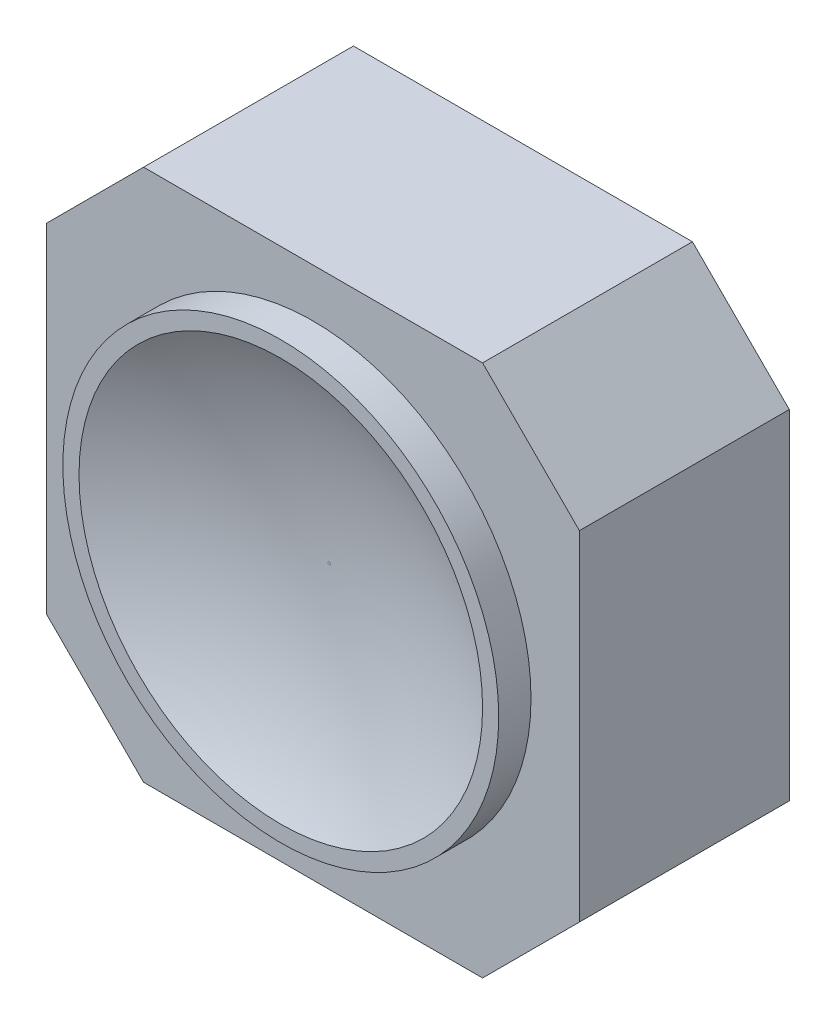
ISO-10303-21;
HEADER;
FILE_DESCRIPTION(('STEP AP214'),'2;1');
FILE_NAME('part.step','',(''),(''),'','','');
FILE_SCHEMA(('AUTOMOTIVE_DESIGN { 1 0 10303 214 1 1 1 1 }'));
ENDSEC;
DATA;
#1=APPLICATION_CONTEXT('core data for automotive mechanical design processes');
#2=APPLICATION_PROTOCOL_DEFINITION('international standard','automotive_design',2000,#1);
#3=PRODUCT_CONTEXT('',#1,'mechanical');
#4=PRODUCT('Part','Part','',(#3));
#5=PRODUCT_RELATED_PRODUCT_CATEGORY('part','',(#4));
#6=PRODUCT_DEFINITION_FORMATION('','',#4);
#7=PRODUCT_DEFINITION_CONTEXT('part definition',#1,'design');
#8=PRODUCT_DEFINITION('design','',#6,#7);
#9=PRODUCT_DEFINITION_SHAPE('','',#8);
#10=(LENGTH_UNIT() NAMED_UNIT(*) SI_UNIT(.MILLI.,.METRE.));
#11=(NAMED_UNIT(*) PLANE_ANGLE_UNIT() SI_UNIT($,.RADIAN.));
#12=(NAMED_UNIT(*) SI_UNIT($,.STERADIAN.) SOLID_ANGLE_UNIT());
#13=UNCERTAINTY_MEASURE_WITH_UNIT(LENGTH_MEASURE(1.E-05),#10,'distance_accuracy_value','');
#14=(GEOMETRIC_REPRESENTATION_CONTEXT(3) GLOBAL_UNCERTAINTY_ASSIGNED_CONTEXT((#13)) GLOBAL_UNIT_ASSIGNED_CONTEXT((#10,
#11,#12)) REPRESENTATION_CONTEXT('',''));
#15=CARTESIAN_POINT('',(0.,0.,0.));
#16=DIRECTION('',(0.,0.,1.));
#17=DIRECTION('',(1.,0.,0.));
#18=AXIS2_PLACEMENT_3D('',#15,#16,#17);
#19=CARTESIAN_POINT('',(0.,0.,3.));
#20=DIRECTION('',(0.,0.,-1.));
#21=DIRECTION('',(-1.,0.,0.));
#22=AXIS2_PLACEMENT_3D('',#19,#20,#21);
#23=CYLINDRICAL_SURFACE('',#22,6.5);
#24=DIRECTION('',(0.,0.,-1.));
#25=VECTOR('',#24,1.);
#26=CARTESIAN_POINT('',(-6.35290287978653,1.375,3.));
#27=LINE('',#26,#25);
#28=CARTESIAN_POINT('',(-6.35290287978653,1.375,0.));
#29=VERTEX_POINT('',#28);
#30=CARTESIAN_POINT('',(-6.35290287978653,1.375,3.));
#31=VERTEX_POINT('',#30);
#32=EDGE_CURVE('E187',#29,#31,#27,.F.);
#33=ORIENTED_EDGE('',*,*,#32,.F.);
#34=CARTESIAN_POINT('',(0.,0.,0.));
#35=DIRECTION('',(0.,0.,-1.));
#36=DIRECTION('',(-1.,0.,0.));
#37=AXIS2_PLACEMENT_3D('',#34,#35,#36);
#38=CIRCLE('',#37,6.5);
#39=CARTESIAN_POINT('',(6.35290287978653,1.375,0.));
#40=VERTEX_POINT('',#39);
#41=EDGE_CURVE('E164',#29,#40,#38,.T.);
#42=ORIENTED_EDGE('',*,*,#41,.T.);
#43=DIRECTION('',(0.,0.,-1.));
#44=VECTOR('',#43,1.);
#45=CARTESIAN_POINT('',(6.35290287978653,1.375,3.));
#46=LINE('',#45,#44);
#47=CARTESIAN_POINT('',(6.35290287978653,1.375,3.));
#48=VERTEX_POINT('',#47);
#49=EDGE_CURVE('E215',#48,#40,#46,.T.);
#50=ORIENTED_EDGE('',*,*,#49,.F.);
#51=CARTESIAN_POINT('',(0.,0.,3.));
#52=DIRECTION('',(0.,0.,-1.));
#53=DIRECTION('',(-1.,0.,0.));
#54=AXIS2_PLACEMENT_3D('',#51,#52,#53);
#55=CIRCLE('',#54,6.5);
#56=EDGE_CURVE('E227',#31,#48,#55,.T.);
#57=ORIENTED_EDGE('',*,*,#56,.F.);
#58=EDGE_LOOP('',(#33,#42,#50,#57));
#59=FACE_BOUND('',#58,.T.);
#60=ADVANCED_FACE('F41',(#59),#23,.F.);
#61=DIRECTION('',(0.,0.,-1.));
#62=VECTOR('',#61,1.);
#63=CARTESIAN_POINT('',(-6.35290287978653,-1.375,3.));
#64=LINE('',#63,#62);
#65=CARTESIAN_POINT('',(-6.35290287978653,-1.375,3.));
#66=VERTEX_POINT('',#65);
#67=CARTESIAN_POINT('',(-6.35290287978653,-1.375,0.));
#68=VERTEX_POINT('',#67);
#69=EDGE_CURVE('E183',#66,#68,#64,.T.);
#70=ORIENTED_EDGE('',*,*,#69,.F.);
#71=CARTESIAN_POINT('',(6.35290287978653,-1.375,3.));
#72=VERTEX_POINT('',#71);
#73=EDGE_CURVE('E222',#72,#66,#55,.T.);
#74=ORIENTED_EDGE('',*,*,#73,.F.);
#75=DIRECTION('',(0.,0.,-1.));
#76=VECTOR('',#75,1.);
#77=CARTESIAN_POINT('',(6.35290287978653,-1.375,3.));
#78=LINE('',#77,#76);
#79=CARTESIAN_POINT('',(6.35290287978653,-1.375,0.));
#80=VERTEX_POINT('',#79);
#81=EDGE_CURVE('E219',#80,#72,#78,.F.);
#82=ORIENTED_EDGE('',*,*,#81,.F.);
#83=EDGE_CURVE('E228',#80,#68,#38,.T.);
#84=ORIENTED_EDGE('',*,*,#83,.T.);
#85=EDGE_LOOP('',(#70,#74,#82,#84));
#86=FACE_BOUND('',#85,.T.);
#87=ADVANCED_FACE('F343',(#86),#23,.F.);
#88=CARTESIAN_POINT('',(0.,0.,3.));
#89=DIRECTION('',(0.,0.,-1.));
#90=DIRECTION('',(-1.,0.,0.));
#91=AXIS2_PLACEMENT_3D('',#88,#89,#90);
#92=PLANE('',#91);
#93=DIRECTION('',(0.,-1.,0.));
#94=VECTOR('',#93,1.);
#95=CARTESIAN_POINT('',(-3.25,1.375,3.));
#96=LINE('',#95,#94);
#97=CARTESIAN_POINT('',(-3.25,1.375,3.));
#98=VERTEX_POINT('',#97);
#99=CARTESIAN_POINT('',(-3.25,-1.375,3.));
#100=VERTEX_POINT('',#99);
#101=EDGE_CURVE('E500',#98,#100,#96,.T.);
#102=ORIENTED_EDGE('',*,*,#101,.F.);
#103=DIRECTION('',(1.,0.,0.));
#104=VECTOR('',#103,1.);
#105=CARTESIAN_POINT('',(-7.20750360727607,1.375,3.));
#106=LINE('',#105,#104);
#107=EDGE_CURVE('E181',#31,#98,#106,.T.);
#108=ORIENTED_EDGE('',*,*,#107,.F.);
#109=ORIENTED_EDGE('',*,*,#56,.T.);
#110=DIRECTION('',(1.,0.,0.));
#111=VECTOR('',#110,1.);
#112=CARTESIAN_POINT('',(7.20750360727607,1.375,3.));
#113=LINE('',#112,#111);
#114=CARTESIAN_POINT('',(3.25,1.375,3.));
#115=VERTEX_POINT('',#114);
#116=EDGE_CURVE('E199',#115,#48,#113,.T.);
#117=ORIENTED_EDGE('',*,*,#116,.F.);
#118=DIRECTION('',(0.,1.,0.));
#119=VECTOR('',#118,1.);
#120=CARTESIAN_POINT('',(3.25,1.375,3.));
#121=LINE('',#120,#119);
#122=CARTESIAN_POINT('',(3.25,-1.375,3.));
#123=VERTEX_POINT('',#122);
#124=EDGE_CURVE('E194',#123,#115,#121,.T.);
#125=ORIENTED_EDGE('',*,*,#124,.F.);
#126=DIRECTION('',(1.,0.,0.));
#127=VECTOR('',#126,1.);
#128=CARTESIAN_POINT('',(0.,-1.375,3.));
#129=LINE('',#128,#127);
#130=EDGE_CURVE('E11',#123,#72,#129,.T.);
#131=ORIENTED_EDGE('',*,*,#130,.T.);
#132=ORIENTED_EDGE('',*,*,#73,.T.);
#133=DIRECTION('',(-1.,0.,0.));
#134=VECTOR('',#133,1.);
#135=CARTESIAN_POINT('',(-7.20750360727607,-1.375,3.));
#136=LINE('',#135,#134);
#137=EDGE_CURVE('E169',#100,#66,#136,.T.);
#138=ORIENTED_EDGE('',*,*,#137,.F.);
#139=EDGE_LOOP('',(#102,#108,#109,#117,#125,#131,#132,#138));
#140=FACE_BOUND('',#139,.T.);
#141=ADVANCED_FACE('F349',(#140),#92,.T.);
#142=CARTESIAN_POINT('',(0.,0.,6.5));
#143=DIRECTION('',(0.,0.,1.));
#144=DIRECTION('',(1.,0.,0.));
#145=AXIS2_PLACEMENT_3D('',#142,#143,#144);
#146=PLANE('',#145);
#147=DIRECTION('',(0.,-1.,0.));
#148=VECTOR('',#147,1.);
#149=CARTESIAN_POINT('',(-8.25,5.25,6.5));
#150=LINE('',#149,#148);
#151=CARTESIAN_POINT('',(-8.25,5.25,6.5));
#152=VERTEX_POINT('',#151);
#153=CARTESIAN_POINT('',(-8.25,-5.25,6.5));
#154=VERTEX_POINT('',#153);
#155=EDGE_CURVE('E244',#152,#154,#150,.T.);
#156=ORIENTED_EDGE('',*,*,#155,.T.);
#157=DIRECTION('',(0.707106781186547,-0.707106781186548,0.));
#158=VECTOR('',#157,1.);
#159=CARTESIAN_POINT('',(-8.25,-5.25,6.5));
#160=LINE('',#159,#158);
#161=CARTESIAN_POINT('',(-5.25,-8.25,6.5));
#162=VERTEX_POINT('',#161);
#163=EDGE_CURVE('E248',#154,#162,#160,.T.);
#164=ORIENTED_EDGE('',*,*,#163,.T.);
#165=DIRECTION('',(1.,0.,0.));
#166=VECTOR('',#165,1.);
#167=CARTESIAN_POINT('',(-5.25,-8.25,6.5));
#168=LINE('',#167,#166);
#169=CARTESIAN_POINT('',(5.25,-8.25,6.5));
#170=VERTEX_POINT('',#169);
#171=EDGE_CURVE('E252',#162,#170,#168,.T.);
#172=ORIENTED_EDGE('',*,*,#171,.T.);
#173=DIRECTION('',(0.707106781186548,0.707106781186548,0.));
#174=VECTOR('',#173,1.);
#175=CARTESIAN_POINT('',(5.25,-8.25,6.5));
#176=LINE('',#175,#174);
#177=CARTESIAN_POINT('',(8.25,-5.25,6.5));
#178=VERTEX_POINT('',#177);
#179=EDGE_CURVE('E255',#170,#178,#176,.T.);
#180=ORIENTED_EDGE('',*,*,#179,.T.);
#181=DIRECTION('',(0.,1.,0.));
#182=VECTOR('',#181,1.);
#183=CARTESIAN_POINT('',(8.25,5.25,6.5));
#184=LINE('',#183,#182);
#185=CARTESIAN_POINT('',(8.25,5.25,6.5));
#186=VERTEX_POINT('',#185);
#187=EDGE_CURVE('E258',#178,#186,#184,.T.);
#188=ORIENTED_EDGE('',*,*,#187,.T.);
#189=DIRECTION('',(-0.707106781186548,0.707106781186547,0.));
#190=VECTOR('',#189,1.);
#191=CARTESIAN_POINT('',(5.25,8.25,6.5));
#192=LINE('',#191,#190);
#193=CARTESIAN_POINT('',(5.25,8.25,6.5));
#194=VERTEX_POINT('',#193);
#195=EDGE_CURVE('E261',#186,#194,#192,.T.);
#196=ORIENTED_EDGE('',*,*,#195,.T.);
#197=DIRECTION('',(-1.,0.,0.));
#198=VECTOR('',#197,1.);
#199=CARTESIAN_POINT('',(-5.25,8.25,6.5));
#200=LINE('',#199,#198);
#201=CARTESIAN_POINT('',(-5.25,8.25,6.5));
#202=VERTEX_POINT('',#201);
#203=EDGE_CURVE('E264',#194,#202,#200,.T.);
#204=ORIENTED_EDGE('',*,*,#203,.T.);
#205=DIRECTION('',(-0.707106781186547,-0.707106781186548,0.));
#206=VECTOR('',#205,1.);
#207=CARTESIAN_POINT('',(-8.25,5.25,6.5));
#208=LINE('',#207,#206);
#209=EDGE_CURVE('E267',#202,#152,#208,.T.);
#210=ORIENTED_EDGE('',*,*,#209,.T.);
#211=EDGE_LOOP('',(#156,#164,#172,#180,#188,#196,#204,#210));
#212=FACE_BOUND('',#211,.T.);
#213=CARTESIAN_POINT('',(0.,0.,6.5));
#214=DIRECTION('',(0.,0.,1.));
#215=DIRECTION('',(1.,0.,0.));
#216=AXIS2_PLACEMENT_3D('',#213,#214,#215);
#217=CIRCLE('',#216,6.75);
#218=CARTESIAN_POINT('',(6.75,0.,6.5));
#219=VERTEX_POINT('',#218);
#220=EDGE_CURVE('E235',#219,#219,#217,.T.);
#221=ORIENTED_EDGE('',*,*,#220,.F.);
#222=EDGE_LOOP('',(#221));
#223=FACE_BOUND('',#222,.T.);
#224=ADVANCED_FACE('F360',(#212,#223),#146,.T.);
#225=CARTESIAN_POINT('',(-8.25,5.25,6.5));
#226=DIRECTION('',(1.,0.,0.));
#227=DIRECTION('',(0.,1.,0.));
#228=AXIS2_PLACEMENT_3D('',#225,#226,#227);
#229=PLANE('',#228);
#230=DIRECTION('',(0.,-1.,0.));
#231=VECTOR('',#230,1.);
#232=CARTESIAN_POINT('',(-8.25,5.25,0.));
#233=LINE('',#232,#231);
#234=CARTESIAN_POINT('',(-8.25,5.25,0.));
#235=VERTEX_POINT('',#234);
#236=CARTESIAN_POINT('',(-8.25,-5.25,0.));
#237=VERTEX_POINT('',#236);
#238=EDGE_CURVE('E240',#235,#237,#233,.T.);
#239=ORIENTED_EDGE('',*,*,#238,.T.);
#240=DIRECTION('',(0.,0.,-1.));
#241=VECTOR('',#240,1.);
#242=CARTESIAN_POINT('',(-8.25,-5.25,6.5));
#243=LINE('',#242,#241);
#244=EDGE_CURVE('E321',#154,#237,#243,.T.);
#245=ORIENTED_EDGE('',*,*,#244,.F.);
#246=ORIENTED_EDGE('',*,*,#155,.F.);
#247=DIRECTION('',(0.,0.,-1.));
#248=VECTOR('',#247,1.);
#249=CARTESIAN_POINT('',(-8.25,5.25,6.5));
#250=LINE('',#249,#248);
#251=EDGE_CURVE('E270',#152,#235,#250,.T.);
#252=ORIENTED_EDGE('',*,*,#251,.T.);
#253=EDGE_LOOP('',(#239,#245,#246,#252));
#254=FACE_BOUND('',#253,.T.);
#255=ADVANCED_FACE('F363',(#254),#229,.F.);
#256=CARTESIAN_POINT('',(-8.25,-5.25,6.5));
#257=DIRECTION('',(0.707106781186548,0.707106781186547,0.));
#258=DIRECTION('',(-0.707106781186547,0.707106781186548,0.));
#259=AXIS2_PLACEMENT_3D('',#256,#257,#258);
#260=PLANE('',#259);
#261=DIRECTION('',(0.707106781186547,-0.707106781186548,0.));
#262=VECTOR('',#261,1.);
#263=CARTESIAN_POINT('',(-8.25,-5.25,0.));
#264=LINE('',#263,#262);
#265=CARTESIAN_POINT('',(-5.25,-8.25,0.));
#266=VERTEX_POINT('',#265);
#267=EDGE_CURVE('E274',#237,#266,#264,.T.);
#268=ORIENTED_EDGE('',*,*,#267,.T.);
#269=DIRECTION('',(0.,0.,-1.));
#270=VECTOR('',#269,1.);
#271=CARTESIAN_POINT('',(-5.25,-8.25,6.5));
#272=LINE('',#271,#270);
#273=EDGE_CURVE('E317',#162,#266,#272,.T.);
#274=ORIENTED_EDGE('',*,*,#273,.F.);
#275=ORIENTED_EDGE('',*,*,#163,.F.);
#276=ORIENTED_EDGE('',*,*,#244,.T.);
#277=EDGE_LOOP('',(#268,#274,#275,#276));
#278=FACE_BOUND('',#277,.T.);
#279=ADVANCED_FACE('F390',(#278),#260,.F.);
#280=CARTESIAN_POINT('',(-5.25,-8.25,6.5));
#281=DIRECTION('',(0.,1.,0.));
#282=DIRECTION('',(0.,0.,1.));
#283=AXIS2_PLACEMENT_3D('',#280,#281,#282);
#284=PLANE('',#283);
#285=DIRECTION('',(1.,0.,0.));
#286=VECTOR('',#285,1.);
#287=CARTESIAN_POINT('',(-5.25,-8.25,0.));
#288=LINE('',#287,#286);
#289=CARTESIAN_POINT('',(5.25,-8.25,0.));
#290=VERTEX_POINT('',#289);
#291=EDGE_CURVE('E277',#266,#290,#288,.T.);
#292=ORIENTED_EDGE('',*,*,#291,.T.);
#293=DIRECTION('',(0.,0.,-1.));
#294=VECTOR('',#293,1.);
#295=CARTESIAN_POINT('',(5.25,-8.25,6.5));
#296=LINE('',#295,#294);
#297=EDGE_CURVE('E313',#170,#290,#296,.T.);
#298=ORIENTED_EDGE('',*,*,#297,.F.);
#299=ORIENTED_EDGE('',*,*,#171,.F.);
#300=ORIENTED_EDGE('',*,*,#273,.T.);
#301=EDGE_LOOP('',(#292,#298,#299,#300));
#302=FACE_BOUND('',#301,.T.);
#303=ADVANCED_FACE('F386',(#302),#284,.F.);
#304=CARTESIAN_POINT('',(5.25,-8.25,6.5));
#305=DIRECTION('',(-0.707106781186548,0.707106781186548,0.));
#306=DIRECTION('',(-0.707106781186548,-0.707106781186548,0.));
#307=AXIS2_PLACEMENT_3D('',#304,#305,#306);
#308=PLANE('',#307);
#309=DIRECTION('',(0.707106781186548,0.707106781186548,0.));
#310=VECTOR('',#309,1.);
#311=CARTESIAN_POINT('',(5.25,-8.25,0.));
#312=LINE('',#311,#310);
#313=CARTESIAN_POINT('',(8.25,-5.25,0.));
#314=VERTEX_POINT('',#313);
#315=EDGE_CURVE('E280',#290,#314,#312,.T.);
#316=ORIENTED_EDGE('',*,*,#315,.T.);
#317=DIRECTION('',(0.,0.,-1.));
#318=VECTOR('',#317,1.);
#319=CARTESIAN_POINT('',(8.25,-5.25,6.5));
#320=LINE('',#319,#318);
#321=EDGE_CURVE('E309',#178,#314,#320,.T.);
#322=ORIENTED_EDGE('',*,*,#321,.F.);
#323=ORIENTED_EDGE('',*,*,#179,.F.);
#324=ORIENTED_EDGE('',*,*,#297,.T.);
#325=EDGE_LOOP('',(#316,#322,#323,#324));
#326=FACE_BOUND('',#325,.T.);
#327=ADVANCED_FACE('F382',(#326),#308,.F.);
#328=CARTESIAN_POINT('',(8.25,5.25,6.5));
#329=DIRECTION('',(-1.,0.,0.));
#330=DIRECTION('',(0.,-1.,0.));
#331=AXIS2_PLACEMENT_3D('',#328,#329,#330);
#332=PLANE('',#331);
#333=DIRECTION('',(0.,1.,0.));
#334=VECTOR('',#333,1.);
#335=CARTESIAN_POINT('',(8.25,5.25,0.));
#336=LINE('',#335,#334);
#337=CARTESIAN_POINT('',(8.25,5.25,0.));
#338=VERTEX_POINT('',#337);
#339=EDGE_CURVE('E283',#314,#338,#336,.T.);
#340=ORIENTED_EDGE('',*,*,#339,.T.);
#341=DIRECTION('',(0.,0.,-1.));
#342=VECTOR('',#341,1.);
#343=CARTESIAN_POINT('',(8.25,5.25,6.5));
#344=LINE('',#343,#342);
#345=EDGE_CURVE('E305',#186,#338,#344,.T.);
#346=ORIENTED_EDGE('',*,*,#345,.F.);
#347=ORIENTED_EDGE('',*,*,#187,.F.);
#348=ORIENTED_EDGE('',*,*,#321,.T.);
#349=EDGE_LOOP('',(#340,#346,#347,#348));
#350=FACE_BOUND('',#349,.T.);
#351=ADVANCED_FACE('F378',(#350),#332,.F.);
#352=CARTESIAN_POINT('',(5.25,8.25,6.5));
#353=DIRECTION('',(-0.707106781186547,-0.707106781186548,0.));
#354=DIRECTION('',(0.707106781186548,-0.707106781186547,0.));
#355=AXIS2_PLACEMENT_3D('',#352,#353,#354);
#356=PLANE('',#355);
#357=DIRECTION('',(-0.707106781186548,0.707106781186547,0.));
#358=VECTOR('',#357,1.);
#359=CARTESIAN_POINT('',(5.25,8.25,0.));
#360=LINE('',#359,#358);
#361=CARTESIAN_POINT('',(5.25,8.25,0.));
#362=VERTEX_POINT('',#361);
#363=EDGE_CURVE('E286',#338,#362,#360,.T.);
#364=ORIENTED_EDGE('',*,*,#363,.T.);
#365=DIRECTION('',(0.,0.,-1.));
#366=VECTOR('',#365,1.);
#367=CARTESIAN_POINT('',(5.25,8.25,6.5));
#368=LINE('',#367,#366);
#369=EDGE_CURVE('E301',#194,#362,#368,.T.);
#370=ORIENTED_EDGE('',*,*,#369,.F.);
#371=ORIENTED_EDGE('',*,*,#195,.F.);
#372=ORIENTED_EDGE('',*,*,#345,.T.);
#373=EDGE_LOOP('',(#364,#370,#371,#372));
#374=FACE_BOUND('',#373,.T.);
#375=ADVANCED_FACE('F374',(#374),#356,.F.);
#376=CARTESIAN_POINT('',(-5.25,8.25,6.5));
#377=DIRECTION('',(0.,-1.,0.));
#378=DIRECTION('',(0.,0.,-1.));
#379=AXIS2_PLACEMENT_3D('',#376,#377,#378);
#380=PLANE('',#379);
#381=DIRECTION('',(-1.,0.,0.));
#382=VECTOR('',#381,1.);
#383=CARTESIAN_POINT('',(-5.25,8.25,0.));
#384=LINE('',#383,#382);
#385=CARTESIAN_POINT('',(-5.25,8.25,0.));
#386=VERTEX_POINT('',#385);
#387=EDGE_CURVE('E289',#362,#386,#384,.T.);
#388=ORIENTED_EDGE('',*,*,#387,.T.);
#389=DIRECTION('',(0.,0.,-1.));
#390=VECTOR('',#389,1.);
#391=CARTESIAN_POINT('',(-5.25,8.25,6.5));
#392=LINE('',#391,#390);
#393=EDGE_CURVE('E297',#202,#386,#392,.T.);
#394=ORIENTED_EDGE('',*,*,#393,.F.);
#395=ORIENTED_EDGE('',*,*,#203,.F.);
#396=ORIENTED_EDGE('',*,*,#369,.T.);
#397=EDGE_LOOP('',(#388,#394,#395,#396));
#398=FACE_BOUND('',#397,.T.);
#399=ADVANCED_FACE('F370',(#398),#380,.F.);
#400=CARTESIAN_POINT('',(-8.25,5.25,6.5));
#401=DIRECTION('',(0.707106781186548,-0.707106781186547,0.));
#402=DIRECTION('',(0.707106781186547,0.707106781186548,0.));
#403=AXIS2_PLACEMENT_3D('',#400,#401,#402);
#404=PLANE('',#403);
#405=DIRECTION('',(-0.707106781186547,-0.707106781186548,0.));
#406=VECTOR('',#405,1.);
#407=CARTESIAN_POINT('',(-8.25,5.25,0.));
#408=LINE('',#407,#406);
#409=EDGE_CURVE('E249',#386,#235,#408,.T.);
#410=ORIENTED_EDGE('',*,*,#409,.T.);
#411=ORIENTED_EDGE('',*,*,#251,.F.);
#412=ORIENTED_EDGE('',*,*,#209,.F.);
#413=ORIENTED_EDGE('',*,*,#393,.T.);
#414=EDGE_LOOP('',(#410,#411,#412,#413));
#415=FACE_BOUND('',#414,.T.);
#416=ADVANCED_FACE('F367',(#415),#404,.F.);
#417=CARTESIAN_POINT('',(0.,0.,0.));
#418=DIRECTION('',(0.,0.,1.));
#419=DIRECTION('',(1.,0.,0.));
#420=AXIS2_PLACEMENT_3D('',#417,#418,#419);
#421=PLANE('',#420);
#422=ORIENTED_EDGE('',*,*,#41,.F.);
#423=DIRECTION('',(1.,0.,0.));
#424=VECTOR('',#423,1.);
#425=CARTESIAN_POINT('',(-7.20750360727607,1.375,0.));
#426=LINE('',#425,#424);
#427=CARTESIAN_POINT('',(-3.25,1.375,0.));
#428=VERTEX_POINT('',#427);
#429=EDGE_CURVE('E157',#29,#428,#426,.T.);
#430=ORIENTED_EDGE('',*,*,#429,.T.);
#431=DIRECTION('',(0.,-1.,0.));
#432=VECTOR('',#431,1.);
#433=CARTESIAN_POINT('',(-3.25,1.375,0.));
#434=LINE('',#433,#432);
#435=CARTESIAN_POINT('',(-3.25,-1.375,0.));
#436=VERTEX_POINT('',#435);
#437=EDGE_CURVE('E162',#428,#436,#434,.T.);
#438=ORIENTED_EDGE('',*,*,#437,.T.);
#439=DIRECTION('',(-1.,0.,0.));
#440=VECTOR('',#439,1.);
#441=CARTESIAN_POINT('',(-7.20750360727607,-1.375,0.));
#442=LINE('',#441,#440);
#443=EDGE_CURVE('E177',#436,#68,#442,.T.);
#444=ORIENTED_EDGE('',*,*,#443,.T.);
#445=ORIENTED_EDGE('',*,*,#83,.F.);
#446=DIRECTION('',(-1.,0.,0.));
#447=VECTOR('',#446,1.);
#448=CARTESIAN_POINT('',(7.20750360727607,-1.375,0.));
#449=LINE('',#448,#447);
#450=CARTESIAN_POINT('',(3.25,-1.375,0.));
#451=VERTEX_POINT('',#450);
#452=EDGE_CURVE('E195',#80,#451,#449,.T.);
#453=ORIENTED_EDGE('',*,*,#452,.T.);
#454=DIRECTION('',(0.,1.,0.));
#455=VECTOR('',#454,1.);
#456=CARTESIAN_POINT('',(3.25,1.375,0.));
#457=LINE('',#456,#455);
#458=CARTESIAN_POINT('',(3.25,1.375,0.));
#459=VERTEX_POINT('',#458);
#460=EDGE_CURVE('E198',#451,#459,#457,.T.);
#461=ORIENTED_EDGE('',*,*,#460,.T.);
#462=DIRECTION('',(1.,0.,0.));
#463=VECTOR('',#462,1.);
#464=CARTESIAN_POINT('',(7.20750360727607,1.375,0.));
#465=LINE('',#464,#463);
#466=EDGE_CURVE('E202',#459,#40,#465,.T.);
#467=ORIENTED_EDGE('',*,*,#466,.T.);
#468=EDGE_LOOP('',(#422,#430,#438,#444,#445,#453,#461,#467));
#469=FACE_BOUND('',#468,.T.);
#470=ORIENTED_EDGE('',*,*,#238,.F.);
#471=ORIENTED_EDGE('',*,*,#409,.F.);
#472=ORIENTED_EDGE('',*,*,#387,.F.);
#473=ORIENTED_EDGE('',*,*,#363,.F.);
#474=ORIENTED_EDGE('',*,*,#339,.F.);
#475=ORIENTED_EDGE('',*,*,#315,.F.);
#476=ORIENTED_EDGE('',*,*,#291,.F.);
#477=ORIENTED_EDGE('',*,*,#267,.F.);
#478=EDGE_LOOP('',(#470,#471,#472,#473,#474,#475,#476,#477));
#479=FACE_BOUND('',#478,.T.);
#480=ADVANCED_FACE('F159',(#469,#479),#421,.F.);
#481=CARTESIAN_POINT('',(0.,0.,7.5));
#482=DIRECTION('',(0.,0.,1.));
#483=DIRECTION('',(1.,0.,0.));
#484=AXIS2_PLACEMENT_3D('',#481,#482,#483);
#485=PLANE('',#484);
#486=CARTESIAN_POINT('',(0.,0.,7.5));
#487=DIRECTION('',(0.,0.,1.));
#488=DIRECTION('',(1.,0.,0.));
#489=AXIS2_PLACEMENT_3D('',#486,#487,#488);
#490=CIRCLE('',#489,6.75);
#491=CARTESIAN_POINT('',(6.75,0.,7.5));
#492=VERTEX_POINT('',#491);
#493=EDGE_CURVE('E236',#492,#492,#490,.T.);
#494=ORIENTED_EDGE('',*,*,#493,.T.);
#495=EDGE_LOOP('',(#494));
#496=FACE_BOUND('',#495,.T.);
#497=CARTESIAN_POINT('',(0.,0.,7.5));
#498=DIRECTION('',(0.,0.,1.));
#499=DIRECTION('',(1.,0.,0.));
#500=AXIS2_PLACEMENT_3D('',#497,#498,#499);
#501=CIRCLE('',#500,6.25);
#502=CARTESIAN_POINT('',(6.25,0.,7.5));
#503=VERTEX_POINT('',#502);
#504=EDGE_CURVE('E226',#503,#503,#501,.T.);
#505=ORIENTED_EDGE('',*,*,#504,.F.);
#506=EDGE_LOOP('',(#505));
#507=FACE_BOUND('',#506,.T.);
#508=ADVANCED_FACE('F353',(#496,#507),#485,.T.);
#509=CARTESIAN_POINT('',(0.,0.,7.5));
#510=DIRECTION('',(0.,0.,-1.));
#511=DIRECTION('',(-1.,0.,0.));
#512=AXIS2_PLACEMENT_3D('',#509,#510,#511);
#513=CYLINDRICAL_SURFACE('',#512,6.75);
#514=ORIENTED_EDGE('',*,*,#493,.F.);
#515=EDGE_LOOP('',(#514));
#516=FACE_BOUND('',#515,.T.);
#517=ORIENTED_EDGE('',*,*,#220,.T.);
#518=EDGE_LOOP('',(#517));
#519=FACE_BOUND('',#518,.T.);
#520=ADVANCED_FACE('F340',(#516,#519),#513,.T.);
#521=CARTESIAN_POINT('',(0.,0.,6.));
#522=DIRECTION('',(0.,0.,1.));
#523=DIRECTION('',(1.,0.,0.));
#524=AXIS2_PLACEMENT_3D('',#521,#522,#523);
#525=PLANE('',#524);
#526=CARTESIAN_POINT('',(0.,0.,6.));
#527=DIRECTION('',(0.,0.,1.));
#528=DIRECTION('',(1.,0.,0.));
#529=AXIS2_PLACEMENT_3D('',#526,#527,#528);
#530=CIRCLE('',#529,0.0411353694898418);
#531=CARTESIAN_POINT('',(0.0411353694898418,0.,6.));
#532=VERTEX_POINT('',#531);
#533=EDGE_CURVE('E50',#532,#532,#530,.T.);
#534=ORIENTED_EDGE('',*,*,#533,.T.);
#535=EDGE_LOOP('',(#534));
#536=FACE_BOUND('',#535,.T.);
#537=ADVANCED_FACE('F328',(#536),#525,.T.);
#538=CARTESIAN_POINT('',(0.,0.,19.6));
#539=DIRECTION('',(0.,0.,-1.));
#540=DIRECTION('',(-1.,0.,0.));
#541=AXIS2_PLACEMENT_3D('',#538,#539,#540);
#542=DEGENERATE_TOROIDAL_SURFACE('',#541,0.0411353694898418,13.6,.T.);
#543=ORIENTED_EDGE('',*,*,#504,.T.);
#544=EDGE_LOOP('',(#543));
#545=FACE_BOUND('',#544,.T.);
#546=ORIENTED_EDGE('',*,*,#533,.F.);
#547=EDGE_LOOP('',(#546));
#548=FACE_BOUND('',#547,.T.);
#549=ADVANCED_FACE('F43',(#545,#548),#542,.F.);
#550=CARTESIAN_POINT('',(7.20750360727607,-1.375,0.));
#551=DIRECTION('',(0.,1.,0.));
#552=DIRECTION('',(0.,0.,1.));
#553=AXIS2_PLACEMENT_3D('',#550,#551,#552);
#554=PLANE('',#553);
#555=ORIENTED_EDGE('',*,*,#452,.F.);
#556=ORIENTED_EDGE('',*,*,#81,.T.);
#557=ORIENTED_EDGE('',*,*,#130,.F.);
#558=DIRECTION('',(0.,0.,1.));
#559=VECTOR('',#558,1.);
#560=CARTESIAN_POINT('',(3.25,-1.375,0.));
#561=LINE('',#560,#559);
#562=EDGE_CURVE('E211',#451,#123,#561,.T.);
#563=ORIENTED_EDGE('',*,*,#562,.F.);
#564=EDGE_LOOP('',(#555,#556,#557,#563));
#565=FACE_BOUND('',#564,.T.);
#566=ADVANCED_FACE('F331',(#565),#554,.F.);
#567=CARTESIAN_POINT('',(7.20750360727607,1.375,0.));
#568=DIRECTION('',(0.,-1.,0.));
#569=DIRECTION('',(0.,0.,-1.));
#570=AXIS2_PLACEMENT_3D('',#567,#568,#569);
#571=PLANE('',#570);
#572=ORIENTED_EDGE('',*,*,#116,.T.);
#573=ORIENTED_EDGE('',*,*,#49,.T.);
#574=ORIENTED_EDGE('',*,*,#466,.F.);
#575=DIRECTION('',(0.,0.,1.));
#576=VECTOR('',#575,1.);
#577=CARTESIAN_POINT('',(3.25,1.375,0.));
#578=LINE('',#577,#576);
#579=EDGE_CURVE('E65',#459,#115,#578,.T.);
#580=ORIENTED_EDGE('',*,*,#579,.T.);
#581=EDGE_LOOP('',(#572,#573,#574,#580));
#582=FACE_BOUND('',#581,.T.);
#583=ADVANCED_FACE('F337',(#582),#571,.F.);
#584=CARTESIAN_POINT('',(3.25,1.375,0.));
#585=DIRECTION('',(1.,0.,0.));
#586=DIRECTION('',(0.,0.,-1.));
#587=AXIS2_PLACEMENT_3D('',#584,#585,#586);
#588=PLANE('',#587);
#589=ORIENTED_EDGE('',*,*,#124,.T.);
#590=ORIENTED_EDGE('',*,*,#579,.F.);
#591=ORIENTED_EDGE('',*,*,#460,.F.);
#592=ORIENTED_EDGE('',*,*,#562,.T.);
#593=EDGE_LOOP('',(#589,#590,#591,#592));
#594=FACE_BOUND('',#593,.T.);
#595=ADVANCED_FACE('F517',(#594),#588,.F.);
#596=CARTESIAN_POINT('',(-7.20750360727607,1.375,0.));
#597=DIRECTION('',(0.,-1.,0.));
#598=DIRECTION('',(1.,0.,0.));
#599=AXIS2_PLACEMENT_3D('',#596,#597,#598);
#600=PLANE('',#599);
#601=ORIENTED_EDGE('',*,*,#429,.F.);
#602=ORIENTED_EDGE('',*,*,#32,.T.);
#603=ORIENTED_EDGE('',*,*,#107,.T.);
#604=DIRECTION('',(0.,0.,1.));
#605=VECTOR('',#604,1.);
#606=CARTESIAN_POINT('',(-3.25,1.375,0.));
#607=LINE('',#606,#605);
#608=EDGE_CURVE('E174',#428,#98,#607,.T.);
#609=ORIENTED_EDGE('',*,*,#608,.F.);
#610=EDGE_LOOP('',(#601,#602,#603,#609));
#611=FACE_BOUND('',#610,.T.);
#612=ADVANCED_FACE('F179',(#611),#600,.F.);
#613=CARTESIAN_POINT('',(-7.20750360727607,-1.375,0.));
#614=DIRECTION('',(0.,1.,0.));
#615=DIRECTION('',(-1.,0.,0.));
#616=AXIS2_PLACEMENT_3D('',#613,#614,#615);
#617=PLANE('',#616);
#618=ORIENTED_EDGE('',*,*,#137,.T.);
#619=ORIENTED_EDGE('',*,*,#69,.T.);
#620=ORIENTED_EDGE('',*,*,#443,.F.);
#621=DIRECTION('',(0.,0.,1.));
#622=VECTOR('',#621,1.);
#623=CARTESIAN_POINT('',(-3.25,-1.375,0.));
#624=LINE('',#623,#622);
#625=EDGE_CURVE('E57',#436,#100,#624,.T.);
#626=ORIENTED_EDGE('',*,*,#625,.T.);
#627=EDGE_LOOP('',(#618,#619,#620,#626));
#628=FACE_BOUND('',#627,.T.);
#629=ADVANCED_FACE('F531',(#628),#617,.F.);
#630=CARTESIAN_POINT('',(-3.25,1.375,0.));
#631=DIRECTION('',(-1.,0.,0.));
#632=DIRECTION('',(0.,0.,1.));
#633=AXIS2_PLACEMENT_3D('',#630,#631,#632);
#634=PLANE('',#633);
#635=ORIENTED_EDGE('',*,*,#101,.T.);
#636=ORIENTED_EDGE('',*,*,#625,.F.);
#637=ORIENTED_EDGE('',*,*,#437,.F.);
#638=ORIENTED_EDGE('',*,*,#608,.T.);
#639=EDGE_LOOP('',(#635,#636,#637,#638));
#640=FACE_BOUND('',#639,.T.);
#641=ADVANCED_FACE('F173',(#640),#634,.F.);
#642=CLOSED_SHELL('',(#60,#87,#141,#224,#255,#279,#303,#327,#351,#375,#399,#416,#480,#508,#520,
#537,#549,#566,#583,#595,#612,#629,#641));
#643=MANIFOLD_SOLID_BREP('B2',#642);
#644=ADVANCED_BREP_SHAPE_REPRESENTATION('',(#18,#643),#14);
#645=SHAPE_DEFINITION_REPRESENTATION(#9,#644);
ENDSEC;
END-ISO-10303-21;
